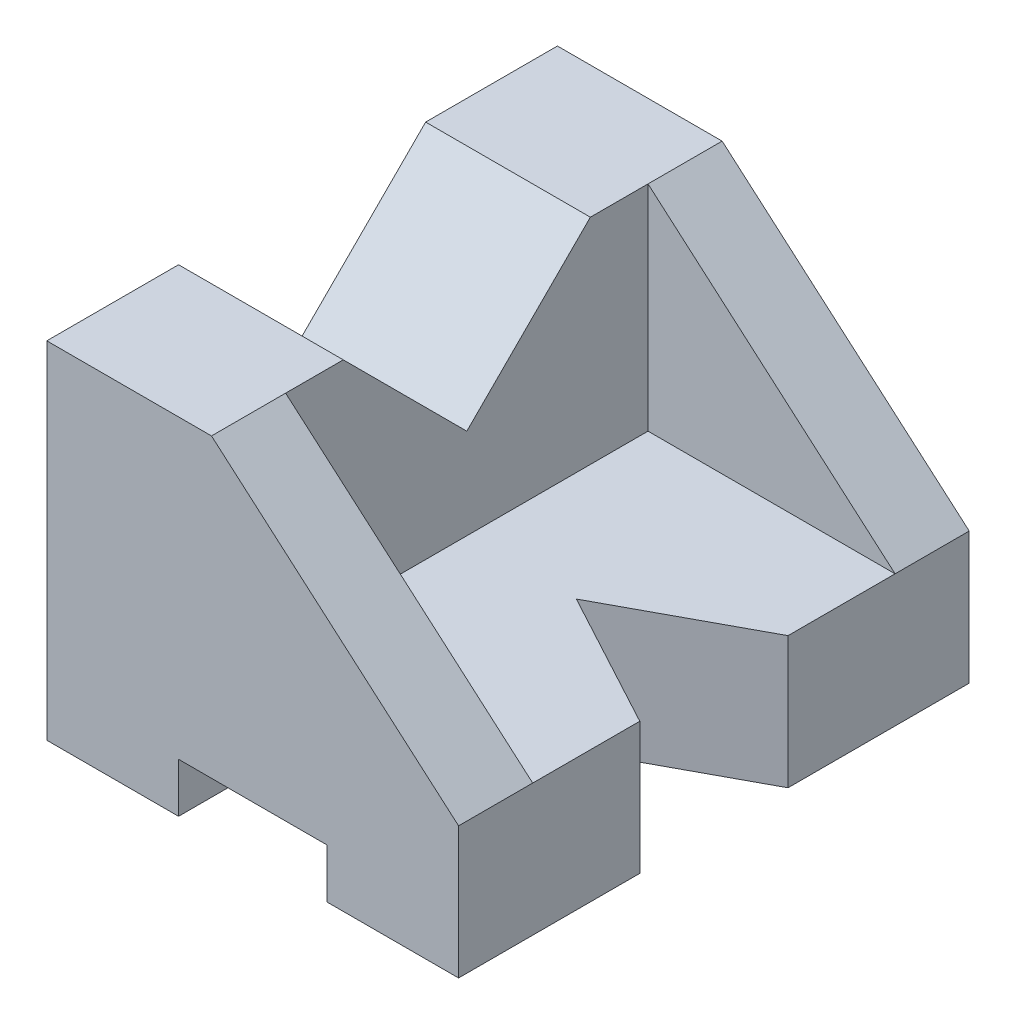
ISO-10303-21;
HEADER;
FILE_DESCRIPTION(('STEP AP214'),'2;1');
FILE_NAME('part.step','',(''),(''),'','','');
FILE_SCHEMA(('AUTOMOTIVE_DESIGN { 1 0 10303 214 1 1 1 1 }'));
ENDSEC;
DATA;
#1=APPLICATION_CONTEXT('core data for automotive mechanical design processes');
#2=APPLICATION_PROTOCOL_DEFINITION('international standard','automotive_design',2000,#1);
#3=PRODUCT_CONTEXT('',#1,'mechanical');
#4=PRODUCT('Part','Part','',(#3));
#5=PRODUCT_RELATED_PRODUCT_CATEGORY('part','',(#4));
#6=PRODUCT_DEFINITION_FORMATION('','',#4);
#7=PRODUCT_DEFINITION_CONTEXT('part definition',#1,'design');
#8=PRODUCT_DEFINITION('design','',#6,#7);
#9=PRODUCT_DEFINITION_SHAPE('','',#8);
#10=(LENGTH_UNIT() NAMED_UNIT(*) SI_UNIT(.MILLI.,.METRE.));
#11=(NAMED_UNIT(*) PLANE_ANGLE_UNIT() SI_UNIT($,.RADIAN.));
#12=(NAMED_UNIT(*) SI_UNIT($,.STERADIAN.) SOLID_ANGLE_UNIT());
#13=UNCERTAINTY_MEASURE_WITH_UNIT(LENGTH_MEASURE(1.E-05),#10,'distance_accuracy_value','');
#14=(GEOMETRIC_REPRESENTATION_CONTEXT(3) GLOBAL_UNCERTAINTY_ASSIGNED_CONTEXT((#13)) GLOBAL_UNIT_ASSIGNED_CONTEXT((#10,
#11,#12)) REPRESENTATION_CONTEXT('',''));
#15=CARTESIAN_POINT('',(0.,0.,0.));
#16=DIRECTION('',(0.,0.,1.));
#17=DIRECTION('',(1.,0.,0.));
#18=AXIS2_PLACEMENT_3D('',#15,#16,#17);
#19=CARTESIAN_POINT('',(34.,0.,31.));
#20=DIRECTION('',(-1.,0.,0.));
#21=DIRECTION('',(0.,0.,1.));
#22=AXIS2_PLACEMENT_3D('',#19,#20,#21);
#23=PLANE('',#22);
#24=DIRECTION('',(0.,-1.,0.));
#25=VECTOR('',#24,1.);
#26=CARTESIAN_POINT('',(34.,-0.001000000000001,0.377003662996497));
#27=LINE('',#26,#25);
#28=CARTESIAN_POINT('',(34.,6.,0.377003662996499));
#29=VERTEX_POINT('',#28);
#30=CARTESIAN_POINT('',(34.,0.,0.377003662996498));
#31=VERTEX_POINT('',#30);
#32=EDGE_CURVE('E188',#29,#31,#27,.T.);
#33=ORIENTED_EDGE('',*,*,#32,.T.);
#34=DIRECTION('',(0.,0.,-1.));
#35=VECTOR('',#34,1.);
#36=CARTESIAN_POINT('',(34.,0.,31.));
#37=LINE('',#36,#35);
#38=CARTESIAN_POINT('',(34.,0.,31.));
#39=VERTEX_POINT('',#38);
#40=EDGE_CURVE('E187',#39,#31,#37,.T.);
#41=ORIENTED_EDGE('',*,*,#40,.F.);
#42=DIRECTION('',(0.,1.,0.));
#43=VECTOR('',#42,1.);
#44=CARTESIAN_POINT('',(34.,0.,31.));
#45=LINE('',#44,#43);
#46=CARTESIAN_POINT('',(34.,6.,31.));
#47=VERTEX_POINT('',#46);
#48=EDGE_CURVE('E291',#39,#47,#45,.T.);
#49=ORIENTED_EDGE('',*,*,#48,.T.);
#50=DIRECTION('',(0.,0.,-1.));
#51=VECTOR('',#50,1.);
#52=CARTESIAN_POINT('',(34.,6.,31.));
#53=LINE('',#52,#51);
#54=EDGE_CURVE('E203',#47,#29,#53,.T.);
#55=ORIENTED_EDGE('',*,*,#54,.T.);
#56=EDGE_LOOP('',(#33,#41,#49,#55));
#57=FACE_BOUND('',#56,.T.);
#58=ADVANCED_FACE('F33',(#57),#23,.T.);
#59=CARTESIAN_POINT('',(0.,0.,31.));
#60=DIRECTION('',(0.,-1.,0.));
#61=DIRECTION('',(1.,0.,0.));
#62=AXIS2_PLACEMENT_3D('',#59,#60,#61);
#63=PLANE('',#62);
#64=DIRECTION('',(0.880296225889344,0.,0.474424445707614));
#65=VECTOR('',#64,1.);
#66=CARTESIAN_POINT('',(33.3004683787167,0.,0.));
#67=LINE('',#66,#65);
#68=CARTESIAN_POINT('',(50.,0.,9.00000000000001));
#69=VERTEX_POINT('',#68);
#70=EDGE_CURVE('E171',#31,#69,#67,.T.);
#71=ORIENTED_EDGE('',*,*,#70,.T.);
#72=DIRECTION('',(0.,0.,-1.));
#73=VECTOR('',#72,1.);
#74=CARTESIAN_POINT('',(50.,0.,31.));
#75=LINE('',#74,#73);
#76=CARTESIAN_POINT('',(50.,0.,31.));
#77=VERTEX_POINT('',#76);
#78=EDGE_CURVE('E185',#77,#69,#75,.T.);
#79=ORIENTED_EDGE('',*,*,#78,.F.);
#80=DIRECTION('',(-1.,0.,0.));
#81=VECTOR('',#80,1.);
#82=CARTESIAN_POINT('',(0.,0.,31.));
#83=LINE('',#82,#81);
#84=EDGE_CURVE('E287',#77,#39,#83,.T.);
#85=ORIENTED_EDGE('',*,*,#84,.T.);
#86=ORIENTED_EDGE('',*,*,#40,.T.);
#87=EDGE_LOOP('',(#71,#79,#85,#86));
#88=FACE_BOUND('',#87,.T.);
#89=ADVANCED_FACE('F183',(#88),#63,.T.);
#90=CARTESIAN_POINT('',(50.,0.,31.));
#91=DIRECTION('',(1.,0.,0.));
#92=DIRECTION('',(0.,0.,-1.));
#93=AXIS2_PLACEMENT_3D('',#90,#91,#92);
#94=PLANE('',#93);
#95=DIRECTION('',(0.,1.,0.));
#96=VECTOR('',#95,1.);
#97=CARTESIAN_POINT('',(50.,-0.001000000000001,9.));
#98=LINE('',#97,#96);
#99=CARTESIAN_POINT('',(50.,16.,9.));
#100=VERTEX_POINT('',#99);
#101=EDGE_CURVE('E168',#69,#100,#98,.T.);
#102=ORIENTED_EDGE('',*,*,#101,.T.);
#103=DIRECTION('',(0.,0.,-1.));
#104=VECTOR('',#103,1.);
#105=CARTESIAN_POINT('',(50.,16.,31.));
#106=LINE('',#105,#104);
#107=CARTESIAN_POINT('',(50.,16.,22.));
#108=VERTEX_POINT('',#107);
#109=EDGE_CURVE('E266',#108,#100,#106,.T.);
#110=ORIENTED_EDGE('',*,*,#109,.F.);
#111=CARTESIAN_POINT('',(50.,16.,31.));
#112=VERTEX_POINT('',#111);
#113=EDGE_CURVE('E198',#112,#108,#106,.T.);
#114=ORIENTED_EDGE('',*,*,#113,.F.);
#115=DIRECTION('',(0.,-1.,0.));
#116=VECTOR('',#115,1.);
#117=CARTESIAN_POINT('',(50.,0.,31.));
#118=LINE('',#117,#116);
#119=EDGE_CURVE('E193',#112,#77,#118,.T.);
#120=ORIENTED_EDGE('',*,*,#119,.T.);
#121=ORIENTED_EDGE('',*,*,#78,.T.);
#122=EDGE_LOOP('',(#102,#110,#114,#120,#121));
#123=FACE_BOUND('',#122,.T.);
#124=ADVANCED_FACE('F191',(#123),#94,.T.);
#125=CARTESIAN_POINT('',(0.,42.,31.));
#126=DIRECTION('',(0.,1.,0.));
#127=DIRECTION('',(0.,0.,1.));
#128=AXIS2_PLACEMENT_3D('',#125,#126,#127);
#129=PLANE('',#128);
#130=DIRECTION('',(1.,0.,0.));
#131=VECTOR('',#130,1.);
#132=CARTESIAN_POINT('',(-0.00100000000001141,42.,-15.));
#133=LINE('',#132,#131);
#134=CARTESIAN_POINT('',(0.,42.,-15.));
#135=VERTEX_POINT('',#134);
#136=CARTESIAN_POINT('',(20.,42.,-15.));
#137=VERTEX_POINT('',#136);
#138=EDGE_CURVE('E345',#135,#137,#133,.T.);
#139=ORIENTED_EDGE('',*,*,#138,.T.);
#140=DIRECTION('',(0.,0.,-1.));
#141=VECTOR('',#140,1.);
#142=CARTESIAN_POINT('',(20.,42.,31.));
#143=LINE('',#142,#141);
#144=CARTESIAN_POINT('',(20.,42.,-22.));
#145=VERTEX_POINT('',#144);
#146=EDGE_CURVE('E256',#137,#145,#143,.T.);
#147=ORIENTED_EDGE('',*,*,#146,.T.);
#148=DIRECTION('',(0.,0.,1.));
#149=VECTOR('',#148,1.);
#150=CARTESIAN_POINT('',(20.,42.,-31.));
#151=LINE('',#150,#149);
#152=CARTESIAN_POINT('',(20.,42.,-31.));
#153=VERTEX_POINT('',#152);
#154=EDGE_CURVE('E306',#153,#145,#151,.T.);
#155=ORIENTED_EDGE('',*,*,#154,.F.);
#156=DIRECTION('',(1.,0.,0.));
#157=VECTOR('',#156,1.);
#158=CARTESIAN_POINT('',(0.,42.,-31.));
#159=LINE('',#158,#157);
#160=CARTESIAN_POINT('',(0.,42.,-31.));
#161=VERTEX_POINT('',#160);
#162=EDGE_CURVE('E242',#161,#153,#159,.T.);
#163=ORIENTED_EDGE('',*,*,#162,.F.);
#164=DIRECTION('',(0.,0.,-1.));
#165=VECTOR('',#164,1.);
#166=CARTESIAN_POINT('',(0.,42.,31.));
#167=LINE('',#166,#165);
#168=EDGE_CURVE('E251',#135,#161,#167,.T.);
#169=ORIENTED_EDGE('',*,*,#168,.F.);
#170=EDGE_LOOP('',(#139,#147,#155,#163,#169));
#171=FACE_BOUND('',#170,.T.);
#172=ADVANCED_FACE('F327',(#171),#129,.T.);
#173=CARTESIAN_POINT('',(0.,16.,31.));
#174=DIRECTION('',(0.,1.,0.));
#175=DIRECTION('',(0.,0.,1.));
#176=AXIS2_PLACEMENT_3D('',#173,#174,#175);
#177=PLANE('',#176);
#178=DIRECTION('',(0.880296225889344,0.,0.474424445707614));
#179=VECTOR('',#178,1.);
#180=CARTESIAN_POINT('',(33.3004683787167,16.,0.));
#181=LINE('',#180,#179);
#182=CARTESIAN_POINT('',(33.3004683787167,16.,0.));
#183=VERTEX_POINT('',#182);
#184=EDGE_CURVE('E174',#183,#100,#181,.T.);
#185=ORIENTED_EDGE('',*,*,#184,.F.);
#186=DIRECTION('',(-0.880296225889344,0.,0.474424445707614));
#187=VECTOR('',#186,1.);
#188=CARTESIAN_POINT('',(50.,16.,-9.));
#189=LINE('',#188,#187);
#190=CARTESIAN_POINT('',(50.,16.,-9.));
#191=VERTEX_POINT('',#190);
#192=EDGE_CURVE('E367',#191,#183,#189,.T.);
#193=ORIENTED_EDGE('',*,*,#192,.F.);
#194=CARTESIAN_POINT('',(50.,16.,-22.));
#195=VERTEX_POINT('',#194);
#196=EDGE_CURVE('E262',#191,#195,#106,.T.);
#197=ORIENTED_EDGE('',*,*,#196,.T.);
#198=DIRECTION('',(1.,0.,0.));
#199=VECTOR('',#198,1.);
#200=CARTESIAN_POINT('',(0.,16.,-22.));
#201=LINE('',#200,#199);
#202=CARTESIAN_POINT('',(20.,16.,-22.));
#203=VERTEX_POINT('',#202);
#204=EDGE_CURVE('E338',#203,#195,#201,.T.);
#205=ORIENTED_EDGE('',*,*,#204,.F.);
#206=DIRECTION('',(0.,0.,-1.));
#207=VECTOR('',#206,1.);
#208=CARTESIAN_POINT('',(20.,16.,31.));
#209=LINE('',#208,#207);
#210=CARTESIAN_POINT('',(20.,16.,22.));
#211=VERTEX_POINT('',#210);
#212=EDGE_CURVE('E259',#211,#203,#209,.T.);
#213=ORIENTED_EDGE('',*,*,#212,.F.);
#214=DIRECTION('',(1.,0.,0.));
#215=VECTOR('',#214,1.);
#216=CARTESIAN_POINT('',(0.,16.,22.));
#217=LINE('',#216,#215);
#218=EDGE_CURVE('E304',#211,#108,#217,.T.);
#219=ORIENTED_EDGE('',*,*,#218,.T.);
#220=ORIENTED_EDGE('',*,*,#109,.T.);
#221=EDGE_LOOP('',(#185,#193,#197,#205,#213,#219,#220));
#222=FACE_BOUND('',#221,.T.);
#223=ADVANCED_FACE('F383',(#222),#177,.T.);
#224=CARTESIAN_POINT('',(20.,0.,31.));
#225=DIRECTION('',(1.,0.,0.));
#226=DIRECTION('',(0.,1.,0.));
#227=AXIS2_PLACEMENT_3D('',#224,#225,#226);
#228=PLANE('',#227);
#229=DIRECTION('',(0.,0.707106781186548,-0.707106781186547));
#230=VECTOR('',#229,1.);
#231=CARTESIAN_POINT('',(20.,27.,0.));
#232=LINE('',#231,#230);
#233=CARTESIAN_POINT('',(20.,27.,0.));
#234=VERTEX_POINT('',#233);
#235=EDGE_CURVE('E348',#234,#137,#232,.T.);
#236=ORIENTED_EDGE('',*,*,#235,.F.);
#237=DIRECTION('',(0.,-0.707106781186547,-0.707106781186548));
#238=VECTOR('',#237,1.);
#239=CARTESIAN_POINT('',(20.,42.,15.));
#240=LINE('',#239,#238);
#241=CARTESIAN_POINT('',(20.,42.,15.));
#242=VERTEX_POINT('',#241);
#243=EDGE_CURVE('E352',#242,#234,#240,.T.);
#244=ORIENTED_EDGE('',*,*,#243,.F.);
#245=CARTESIAN_POINT('',(20.,42.,22.));
#246=VERTEX_POINT('',#245);
#247=EDGE_CURVE('E260',#246,#242,#143,.T.);
#248=ORIENTED_EDGE('',*,*,#247,.F.);
#249=DIRECTION('',(0.,-1.,0.));
#250=VECTOR('',#249,1.);
#251=CARTESIAN_POINT('',(20.,0.,22.));
#252=LINE('',#251,#250);
#253=EDGE_CURVE('E297',#246,#211,#252,.T.);
#254=ORIENTED_EDGE('',*,*,#253,.T.);
#255=ORIENTED_EDGE('',*,*,#212,.T.);
#256=DIRECTION('',(0.,-1.,0.));
#257=VECTOR('',#256,1.);
#258=CARTESIAN_POINT('',(20.,0.,-22.));
#259=LINE('',#258,#257);
#260=EDGE_CURVE('E334',#145,#203,#259,.T.);
#261=ORIENTED_EDGE('',*,*,#260,.F.);
#262=ORIENTED_EDGE('',*,*,#146,.F.);
#263=EDGE_LOOP('',(#236,#244,#248,#254,#255,#261,#262));
#264=FACE_BOUND('',#263,.T.);
#265=ADVANCED_FACE('F388',(#264),#228,.T.);
#266=CARTESIAN_POINT('',(0.,0.,31.));
#267=DIRECTION('',(0.,-1.,0.));
#268=DIRECTION('',(1.,0.,0.));
#269=AXIS2_PLACEMENT_3D('',#266,#267,#268);
#270=PLANE('',#269);
#271=DIRECTION('',(-1.,0.,0.));
#272=VECTOR('',#271,1.);
#273=CARTESIAN_POINT('',(0.,0.,-31.));
#274=LINE('',#273,#272);
#275=CARTESIAN_POINT('',(16.,0.,-31.));
#276=VERTEX_POINT('',#275);
#277=CARTESIAN_POINT('',(0.,0.,-31.));
#278=VERTEX_POINT('',#277);
#279=EDGE_CURVE('E226',#276,#278,#274,.T.);
#280=ORIENTED_EDGE('',*,*,#279,.F.);
#281=DIRECTION('',(0.,0.,-1.));
#282=VECTOR('',#281,1.);
#283=CARTESIAN_POINT('',(16.,0.,31.));
#284=LINE('',#283,#282);
#285=CARTESIAN_POINT('',(16.,0.,31.));
#286=VERTEX_POINT('',#285);
#287=EDGE_CURVE('E11',#286,#276,#284,.T.);
#288=ORIENTED_EDGE('',*,*,#287,.F.);
#289=DIRECTION('',(-1.,0.,0.));
#290=VECTOR('',#289,1.);
#291=CARTESIAN_POINT('',(0.,0.,31.));
#292=LINE('',#291,#290);
#293=CARTESIAN_POINT('',(0.,0.,31.));
#294=VERTEX_POINT('',#293);
#295=EDGE_CURVE('E248',#286,#294,#292,.T.);
#296=ORIENTED_EDGE('',*,*,#295,.T.);
#297=DIRECTION('',(0.,0.,-1.));
#298=VECTOR('',#297,1.);
#299=CARTESIAN_POINT('',(0.,0.,31.));
#300=LINE('',#299,#298);
#301=EDGE_CURVE('E249',#294,#278,#300,.T.);
#302=ORIENTED_EDGE('',*,*,#301,.T.);
#303=EDGE_LOOP('',(#280,#288,#296,#302));
#304=FACE_BOUND('',#303,.T.);
#305=ADVANCED_FACE('F35',(#304),#270,.T.);
#306=CARTESIAN_POINT('',(16.,0.,31.));
#307=DIRECTION('',(1.,0.,0.));
#308=DIRECTION('',(0.,0.,-1.));
#309=AXIS2_PLACEMENT_3D('',#306,#307,#308);
#310=PLANE('',#309);
#311=DIRECTION('',(0.,-1.,0.));
#312=VECTOR('',#311,1.);
#313=CARTESIAN_POINT('',(16.,0.,-31.));
#314=LINE('',#313,#312);
#315=CARTESIAN_POINT('',(16.,6.,-31.));
#316=VERTEX_POINT('',#315);
#317=EDGE_CURVE('E221',#316,#276,#314,.T.);
#318=ORIENTED_EDGE('',*,*,#317,.F.);
#319=DIRECTION('',(0.,0.,-1.));
#320=VECTOR('',#319,1.);
#321=CARTESIAN_POINT('',(16.,6.,31.));
#322=LINE('',#321,#320);
#323=CARTESIAN_POINT('',(16.,6.,31.));
#324=VERTEX_POINT('',#323);
#325=EDGE_CURVE('E41',#324,#316,#322,.T.);
#326=ORIENTED_EDGE('',*,*,#325,.F.);
#327=DIRECTION('',(0.,-1.,0.));
#328=VECTOR('',#327,1.);
#329=CARTESIAN_POINT('',(16.,0.,31.));
#330=LINE('',#329,#328);
#331=EDGE_CURVE('E310',#324,#286,#330,.T.);
#332=ORIENTED_EDGE('',*,*,#331,.T.);
#333=ORIENTED_EDGE('',*,*,#287,.T.);
#334=EDGE_LOOP('',(#318,#326,#332,#333));
#335=FACE_BOUND('',#334,.T.);
#336=ADVANCED_FACE('F222',(#335),#310,.T.);
#337=CARTESIAN_POINT('',(0.,5.99999999999999,31.));
#338=DIRECTION('',(0.,-1.,0.));
#339=DIRECTION('',(1.,0.,0.));
#340=AXIS2_PLACEMENT_3D('',#337,#338,#339);
#341=PLANE('',#340);
#342=DIRECTION('',(0.880296225889344,0.,0.474424445707614));
#343=VECTOR('',#342,1.);
#344=CARTESIAN_POINT('',(33.3004683787167,6.,0.));
#345=LINE('',#344,#343);
#346=CARTESIAN_POINT('',(33.3004683787167,6.,0.));
#347=VERTEX_POINT('',#346);
#348=EDGE_CURVE('E370',#347,#29,#345,.T.);
#349=ORIENTED_EDGE('',*,*,#348,.T.);
#350=ORIENTED_EDGE('',*,*,#54,.F.);
#351=DIRECTION('',(-1.,0.,0.));
#352=VECTOR('',#351,1.);
#353=CARTESIAN_POINT('',(0.,5.99999999999999,31.));
#354=LINE('',#353,#352);
#355=EDGE_CURVE('E216',#47,#324,#354,.T.);
#356=ORIENTED_EDGE('',*,*,#355,.T.);
#357=ORIENTED_EDGE('',*,*,#325,.T.);
#358=DIRECTION('',(-1.,0.,0.));
#359=VECTOR('',#358,1.);
#360=CARTESIAN_POINT('',(0.,5.99999999999999,-31.));
#361=LINE('',#360,#359);
#362=CARTESIAN_POINT('',(34.,6.,-31.));
#363=VERTEX_POINT('',#362);
#364=EDGE_CURVE('E213',#363,#316,#361,.T.);
#365=ORIENTED_EDGE('',*,*,#364,.F.);
#366=CARTESIAN_POINT('',(34.,6.,-0.377003662996499));
#367=VERTEX_POINT('',#366);
#368=EDGE_CURVE('E202',#367,#363,#53,.T.);
#369=ORIENTED_EDGE('',*,*,#368,.F.);
#370=DIRECTION('',(-0.880296225889344,0.,0.474424445707614));
#371=VECTOR('',#370,1.);
#372=CARTESIAN_POINT('',(50.,6.,-9.));
#373=LINE('',#372,#371);
#374=EDGE_CURVE('E356',#367,#347,#373,.T.);
#375=ORIENTED_EDGE('',*,*,#374,.T.);
#376=EDGE_LOOP('',(#349,#350,#356,#357,#365,#369,#375));
#377=FACE_BOUND('',#376,.T.);
#378=ADVANCED_FACE('F210',(#377),#341,.T.);
#379=DIRECTION('',(0.,1.,0.));
#380=VECTOR('',#379,1.);
#381=CARTESIAN_POINT('',(34.,-0.001000000000001,-0.377003662996497));
#382=LINE('',#381,#380);
#383=CARTESIAN_POINT('',(34.,0.,-0.377003662996497));
#384=VERTEX_POINT('',#383);
#385=EDGE_CURVE('E359',#384,#367,#382,.T.);
#386=ORIENTED_EDGE('',*,*,#385,.T.);
#387=ORIENTED_EDGE('',*,*,#368,.T.);
#388=DIRECTION('',(0.,1.,0.));
#389=VECTOR('',#388,1.);
#390=CARTESIAN_POINT('',(34.,0.,-31.));
#391=LINE('',#390,#389);
#392=CARTESIAN_POINT('',(34.,0.,-31.));
#393=VERTEX_POINT('',#392);
#394=EDGE_CURVE('E232',#393,#363,#391,.T.);
#395=ORIENTED_EDGE('',*,*,#394,.F.);
#396=EDGE_CURVE('E194',#384,#393,#37,.T.);
#397=ORIENTED_EDGE('',*,*,#396,.F.);
#398=EDGE_LOOP('',(#386,#387,#395,#397));
#399=FACE_BOUND('',#398,.T.);
#400=ADVANCED_FACE('F376',(#399),#23,.T.);
#401=DIRECTION('',(-0.880296225889344,0.,0.474424445707614));
#402=VECTOR('',#401,1.);
#403=CARTESIAN_POINT('',(50.,0.,-9.));
#404=LINE('',#403,#402);
#405=CARTESIAN_POINT('',(50.,0.,-8.99999999999999));
#406=VERTEX_POINT('',#405);
#407=EDGE_CURVE('E48',#406,#384,#404,.T.);
#408=ORIENTED_EDGE('',*,*,#407,.T.);
#409=ORIENTED_EDGE('',*,*,#396,.T.);
#410=DIRECTION('',(-1.,0.,0.));
#411=VECTOR('',#410,1.);
#412=CARTESIAN_POINT('',(0.,0.,-31.));
#413=LINE('',#412,#411);
#414=CARTESIAN_POINT('',(50.,0.,-31.));
#415=VERTEX_POINT('',#414);
#416=EDGE_CURVE('E234',#415,#393,#413,.T.);
#417=ORIENTED_EDGE('',*,*,#416,.F.);
#418=EDGE_CURVE('E195',#406,#415,#75,.T.);
#419=ORIENTED_EDGE('',*,*,#418,.F.);
#420=EDGE_LOOP('',(#408,#409,#417,#419));
#421=FACE_BOUND('',#420,.T.);
#422=ADVANCED_FACE('F379',(#421),#63,.T.);
#423=DIRECTION('',(0.,1.,0.));
#424=VECTOR('',#423,1.);
#425=CARTESIAN_POINT('',(50.,-0.001000000000001,-9.));
#426=LINE('',#425,#424);
#427=EDGE_CURVE('E363',#406,#191,#426,.T.);
#428=ORIENTED_EDGE('',*,*,#427,.F.);
#429=ORIENTED_EDGE('',*,*,#418,.T.);
#430=DIRECTION('',(0.,-1.,0.));
#431=VECTOR('',#430,1.);
#432=CARTESIAN_POINT('',(50.,0.,-31.));
#433=LINE('',#432,#431);
#434=CARTESIAN_POINT('',(50.,16.,-31.));
#435=VERTEX_POINT('',#434);
#436=EDGE_CURVE('E239',#435,#415,#433,.T.);
#437=ORIENTED_EDGE('',*,*,#436,.F.);
#438=DIRECTION('',(0.,0.,1.));
#439=VECTOR('',#438,1.);
#440=CARTESIAN_POINT('',(50.,16.,-31.));
#441=LINE('',#440,#439);
#442=EDGE_CURVE('E302',#435,#195,#441,.T.);
#443=ORIENTED_EDGE('',*,*,#442,.T.);
#444=ORIENTED_EDGE('',*,*,#196,.F.);
#445=EDGE_LOOP('',(#428,#429,#437,#443,#444));
#446=FACE_BOUND('',#445,.T.);
#447=ADVANCED_FACE('F382',(#446),#94,.T.);
#448=DIRECTION('',(1.,0.,0.));
#449=VECTOR('',#448,1.);
#450=CARTESIAN_POINT('',(-0.00100000000001141,42.,15.));
#451=LINE('',#450,#449);
#452=CARTESIAN_POINT('',(0.,42.,15.));
#453=VERTEX_POINT('',#452);
#454=EDGE_CURVE('E346',#453,#242,#451,.T.);
#455=ORIENTED_EDGE('',*,*,#454,.F.);
#456=CARTESIAN_POINT('',(0.,42.,31.));
#457=VERTEX_POINT('',#456);
#458=EDGE_CURVE('E253',#457,#453,#167,.T.);
#459=ORIENTED_EDGE('',*,*,#458,.F.);
#460=DIRECTION('',(1.,0.,0.));
#461=VECTOR('',#460,1.);
#462=CARTESIAN_POINT('',(0.,42.,31.));
#463=LINE('',#462,#461);
#464=CARTESIAN_POINT('',(20.,42.,31.));
#465=VERTEX_POINT('',#464);
#466=EDGE_CURVE('E288',#457,#465,#463,.T.);
#467=ORIENTED_EDGE('',*,*,#466,.T.);
#468=EDGE_CURVE('E257',#465,#246,#143,.T.);
#469=ORIENTED_EDGE('',*,*,#468,.T.);
#470=ORIENTED_EDGE('',*,*,#247,.T.);
#471=EDGE_LOOP('',(#455,#459,#467,#469,#470));
#472=FACE_BOUND('',#471,.T.);
#473=ADVANCED_FACE('F393',(#472),#129,.T.);
#474=CARTESIAN_POINT('',(0.,0.,31.));
#475=DIRECTION('',(-1.,0.,0.));
#476=DIRECTION('',(0.,0.,1.));
#477=AXIS2_PLACEMENT_3D('',#474,#475,#476);
#478=PLANE('',#477);
#479=DIRECTION('',(0.,0.707106781186548,-0.707106781186547));
#480=VECTOR('',#479,1.);
#481=CARTESIAN_POINT('',(0.,27.,0.));
#482=LINE('',#481,#480);
#483=CARTESIAN_POINT('',(0.,27.,0.));
#484=VERTEX_POINT('',#483);
#485=EDGE_CURVE('E354',#484,#135,#482,.T.);
#486=ORIENTED_EDGE('',*,*,#485,.T.);
#487=ORIENTED_EDGE('',*,*,#168,.T.);
#488=DIRECTION('',(0.,1.,0.));
#489=VECTOR('',#488,1.);
#490=CARTESIAN_POINT('',(0.,0.,-31.));
#491=LINE('',#490,#489);
#492=EDGE_CURVE('E245',#278,#161,#491,.T.);
#493=ORIENTED_EDGE('',*,*,#492,.F.);
#494=ORIENTED_EDGE('',*,*,#301,.F.);
#495=DIRECTION('',(0.,1.,0.));
#496=VECTOR('',#495,1.);
#497=CARTESIAN_POINT('',(0.,0.,31.));
#498=LINE('',#497,#496);
#499=EDGE_CURVE('E252',#294,#457,#498,.T.);
#500=ORIENTED_EDGE('',*,*,#499,.T.);
#501=ORIENTED_EDGE('',*,*,#458,.T.);
#502=DIRECTION('',(0.,-0.707106781186547,-0.707106781186548));
#503=VECTOR('',#502,1.);
#504=CARTESIAN_POINT('',(0.,42.,15.));
#505=LINE('',#504,#503);
#506=EDGE_CURVE('E341',#453,#484,#505,.T.);
#507=ORIENTED_EDGE('',*,*,#506,.T.);
#508=EDGE_LOOP('',(#486,#487,#493,#494,#500,#501,#507));
#509=FACE_BOUND('',#508,.T.);
#510=ADVANCED_FACE('F319',(#509),#478,.T.);
#511=CARTESIAN_POINT('',(0.,0.,31.));
#512=DIRECTION('',(0.,0.,1.));
#513=DIRECTION('',(1.,0.,0.));
#514=AXIS2_PLACEMENT_3D('',#511,#512,#513);
#515=PLANE('',#514);
#516=ORIENTED_EDGE('',*,*,#119,.F.);
#517=DIRECTION('',(-0.755689082789818,0.654930538417842,0.));
#518=VECTOR('',#517,1.);
#519=CARTESIAN_POINT('',(29.3654822335025,33.8832487309645,31.));
#520=LINE('',#519,#518);
#521=EDGE_CURVE('E282',#112,#465,#520,.T.);
#522=ORIENTED_EDGE('',*,*,#521,.T.);
#523=ORIENTED_EDGE('',*,*,#466,.F.);
#524=ORIENTED_EDGE('',*,*,#499,.F.);
#525=ORIENTED_EDGE('',*,*,#295,.F.);
#526=ORIENTED_EDGE('',*,*,#331,.F.);
#527=ORIENTED_EDGE('',*,*,#355,.F.);
#528=ORIENTED_EDGE('',*,*,#48,.F.);
#529=ORIENTED_EDGE('',*,*,#84,.F.);
#530=EDGE_LOOP('',(#516,#522,#523,#524,#525,#526,#527,#528,#529));
#531=FACE_BOUND('',#530,.T.);
#532=ADVANCED_FACE('F284',(#531),#515,.T.);
#533=CARTESIAN_POINT('',(0.,0.,-31.));
#534=DIRECTION('',(0.,0.,1.));
#535=DIRECTION('',(1.,0.,0.));
#536=AXIS2_PLACEMENT_3D('',#533,#534,#535);
#537=PLANE('',#536);
#538=DIRECTION('',(-0.755689082789818,0.654930538417842,0.));
#539=VECTOR('',#538,1.);
#540=CARTESIAN_POINT('',(29.3654822335025,33.8832487309645,-31.));
#541=LINE('',#540,#539);
#542=EDGE_CURVE('E322',#435,#153,#541,.T.);
#543=ORIENTED_EDGE('',*,*,#542,.F.);
#544=ORIENTED_EDGE('',*,*,#436,.T.);
#545=ORIENTED_EDGE('',*,*,#416,.T.);
#546=ORIENTED_EDGE('',*,*,#394,.T.);
#547=ORIENTED_EDGE('',*,*,#364,.T.);
#548=ORIENTED_EDGE('',*,*,#317,.T.);
#549=ORIENTED_EDGE('',*,*,#279,.T.);
#550=ORIENTED_EDGE('',*,*,#492,.T.);
#551=ORIENTED_EDGE('',*,*,#162,.T.);
#552=EDGE_LOOP('',(#543,#544,#545,#546,#547,#548,#549,#550,#551));
#553=FACE_BOUND('',#552,.T.);
#554=ADVANCED_FACE('F229',(#553),#537,.F.);
#555=CARTESIAN_POINT('',(29.3654822335025,33.8832487309645,31.));
#556=DIRECTION('',(-0.654930538417842,-0.755689082789818,0.));
#557=DIRECTION('',(0.755689082789818,-0.654930538417842,0.));
#558=AXIS2_PLACEMENT_3D('',#555,#556,#557);
#559=PLANE('',#558);
#560=DIRECTION('',(-0.755689082789818,0.654930538417842,0.));
#561=VECTOR('',#560,1.);
#562=CARTESIAN_POINT('',(29.3654822335025,33.8832487309645,22.));
#563=LINE('',#562,#561);
#564=EDGE_CURVE('E279',#108,#246,#563,.T.);
#565=ORIENTED_EDGE('',*,*,#564,.T.);
#566=ORIENTED_EDGE('',*,*,#468,.F.);
#567=ORIENTED_EDGE('',*,*,#521,.F.);
#568=ORIENTED_EDGE('',*,*,#113,.T.);
#569=EDGE_LOOP('',(#565,#566,#567,#568));
#570=FACE_BOUND('',#569,.T.);
#571=ADVANCED_FACE('F276',(#570),#559,.F.);
#572=CARTESIAN_POINT('',(0.,0.,22.));
#573=DIRECTION('',(0.,0.,1.));
#574=DIRECTION('',(1.,0.,0.));
#575=AXIS2_PLACEMENT_3D('',#572,#573,#574);
#576=PLANE('',#575);
#577=ORIENTED_EDGE('',*,*,#218,.F.);
#578=ORIENTED_EDGE('',*,*,#253,.F.);
#579=ORIENTED_EDGE('',*,*,#564,.F.);
#580=EDGE_LOOP('',(#577,#578,#579));
#581=FACE_BOUND('',#580,.T.);
#582=ADVANCED_FACE('F386',(#581),#576,.F.);
#583=CARTESIAN_POINT('',(29.3654822335025,33.8832487309645,-31.));
#584=DIRECTION('',(0.654930538417842,0.755689082789818,0.));
#585=DIRECTION('',(-0.755689082789818,0.654930538417842,0.));
#586=AXIS2_PLACEMENT_3D('',#583,#584,#585);
#587=PLANE('',#586);
#588=DIRECTION('',(-0.755689082789818,0.654930538417842,0.));
#589=VECTOR('',#588,1.);
#590=CARTESIAN_POINT('',(29.3654822335025,33.8832487309645,-22.));
#591=LINE('',#590,#589);
#592=EDGE_CURVE('E336',#195,#145,#591,.T.);
#593=ORIENTED_EDGE('',*,*,#592,.F.);
#594=ORIENTED_EDGE('',*,*,#442,.F.);
#595=ORIENTED_EDGE('',*,*,#542,.T.);
#596=ORIENTED_EDGE('',*,*,#154,.T.);
#597=EDGE_LOOP('',(#593,#594,#595,#596));
#598=FACE_BOUND('',#597,.T.);
#599=ADVANCED_FACE('F405',(#598),#587,.T.);
#600=CARTESIAN_POINT('',(0.,0.,-22.));
#601=DIRECTION('',(0.,0.,1.));
#602=DIRECTION('',(1.,0.,0.));
#603=AXIS2_PLACEMENT_3D('',#600,#601,#602);
#604=PLANE('',#603);
#605=ORIENTED_EDGE('',*,*,#204,.T.);
#606=ORIENTED_EDGE('',*,*,#592,.T.);
#607=ORIENTED_EDGE('',*,*,#260,.T.);
#608=EDGE_LOOP('',(#605,#606,#607));
#609=FACE_BOUND('',#608,.T.);
#610=ADVANCED_FACE('F398',(#609),#604,.T.);
#611=CARTESIAN_POINT('',(-0.00100000000000794,27.,0.));
#612=DIRECTION('',(0.,-0.707106781186547,-0.707106781186548));
#613=DIRECTION('',(0.,0.707106781186548,-0.707106781186547));
#614=AXIS2_PLACEMENT_3D('',#611,#612,#613);
#615=PLANE('',#614);
#616=DIRECTION('',(1.,0.,0.));
#617=VECTOR('',#616,1.);
#618=CARTESIAN_POINT('',(-0.00100000000000794,27.,0.));
#619=LINE('',#618,#617);
#620=EDGE_CURVE('E56',#484,#234,#619,.T.);
#621=ORIENTED_EDGE('',*,*,#620,.T.);
#622=ORIENTED_EDGE('',*,*,#235,.T.);
#623=ORIENTED_EDGE('',*,*,#138,.F.);
#624=ORIENTED_EDGE('',*,*,#485,.F.);
#625=EDGE_LOOP('',(#621,#622,#623,#624));
#626=FACE_BOUND('',#625,.T.);
#627=ADVANCED_FACE('F396',(#626),#615,.F.);
#628=CARTESIAN_POINT('',(-0.00100000000001141,42.,15.));
#629=DIRECTION('',(0.,-0.707106781186548,0.707106781186547));
#630=DIRECTION('',(0.,-0.707106781186547,-0.707106781186548));
#631=AXIS2_PLACEMENT_3D('',#628,#629,#630);
#632=PLANE('',#631);
#633=ORIENTED_EDGE('',*,*,#454,.T.);
#634=ORIENTED_EDGE('',*,*,#243,.T.);
#635=ORIENTED_EDGE('',*,*,#620,.F.);
#636=ORIENTED_EDGE('',*,*,#506,.F.);
#637=EDGE_LOOP('',(#633,#634,#635,#636));
#638=FACE_BOUND('',#637,.T.);
#639=ADVANCED_FACE('F394',(#638),#632,.F.);
#640=CARTESIAN_POINT('',(33.3004683787167,-0.001000000000001,0.));
#641=DIRECTION('',(-0.474424445707614,0.,0.880296225889344));
#642=DIRECTION('',(0.880296225889344,0.,0.474424445707614));
#643=AXIS2_PLACEMENT_3D('',#640,#641,#642);
#644=PLANE('',#643);
#645=DIRECTION('',(0.,1.,0.));
#646=VECTOR('',#645,1.);
#647=CARTESIAN_POINT('',(33.3004683787167,-0.001000000000001,0.));
#648=LINE('',#647,#646);
#649=EDGE_CURVE('E179',#347,#183,#648,.T.);
#650=ORIENTED_EDGE('',*,*,#649,.T.);
#651=ORIENTED_EDGE('',*,*,#184,.T.);
#652=ORIENTED_EDGE('',*,*,#101,.F.);
#653=ORIENTED_EDGE('',*,*,#70,.F.);
#654=ORIENTED_EDGE('',*,*,#32,.F.);
#655=ORIENTED_EDGE('',*,*,#348,.F.);
#656=EDGE_LOOP('',(#650,#651,#652,#653,#654,#655));
#657=FACE_BOUND('',#656,.T.);
#658=ADVANCED_FACE('F170',(#657),#644,.F.);
#659=CARTESIAN_POINT('',(50.,-0.001000000000001,-9.));
#660=DIRECTION('',(-0.474424445707614,0.,-0.880296225889344));
#661=DIRECTION('',(-0.880296225889344,0.,0.474424445707614));
#662=AXIS2_PLACEMENT_3D('',#659,#660,#661);
#663=PLANE('',#662);
#664=ORIENTED_EDGE('',*,*,#385,.F.);
#665=ORIENTED_EDGE('',*,*,#407,.F.);
#666=ORIENTED_EDGE('',*,*,#427,.T.);
#667=ORIENTED_EDGE('',*,*,#192,.T.);
#668=ORIENTED_EDGE('',*,*,#649,.F.);
#669=ORIENTED_EDGE('',*,*,#374,.F.);
#670=EDGE_LOOP('',(#664,#665,#666,#667,#668,#669));
#671=FACE_BOUND('',#670,.T.);
#672=ADVANCED_FACE('F373',(#671),#663,.F.);
#673=CLOSED_SHELL('',(#58,#89,#124,#172,#223,#265,#305,#336,#378,#400,#422,#447,#473,#510,#532,
#554,#571,#582,#599,#610,#627,#639,#658,#672));
#674=MANIFOLD_SOLID_BREP('B2',#673);
#675=ADVANCED_BREP_SHAPE_REPRESENTATION('',(#18,#674),#14);
#676=SHAPE_DEFINITION_REPRESENTATION(#9,#675);
ENDSEC;
END-ISO-10303-21;
